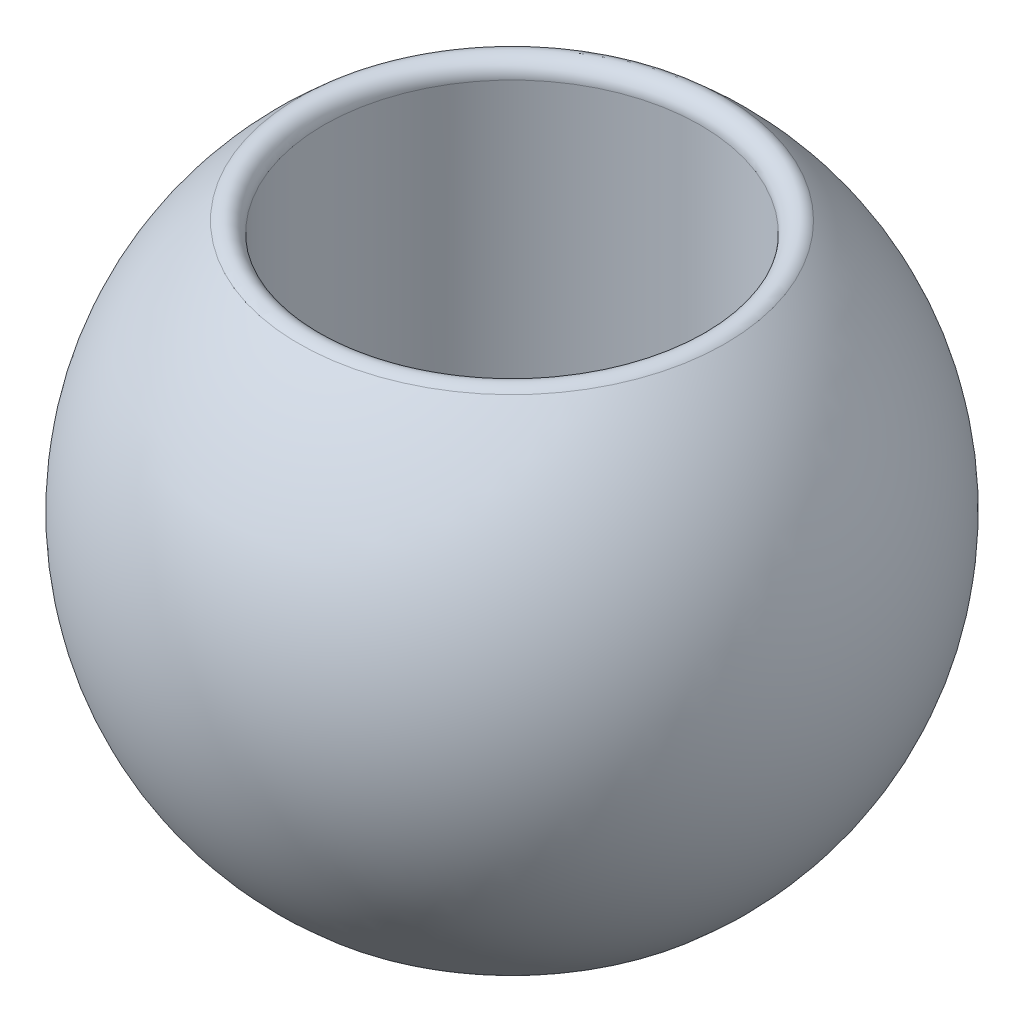
ISO-10303-21;
HEADER;
FILE_DESCRIPTION(('STEP AP214'),'2;1');
FILE_NAME('part.step','',(''),(''),'','','');
FILE_SCHEMA(('AUTOMOTIVE_DESIGN { 1 0 10303 214 1 1 1 1 }'));
ENDSEC;
DATA;
#1=APPLICATION_CONTEXT('core data for automotive mechanical design processes');
#2=APPLICATION_PROTOCOL_DEFINITION('international standard','automotive_design',2000,#1);
#3=PRODUCT_CONTEXT('',#1,'mechanical');
#4=PRODUCT('Part','Part','',(#3));
#5=PRODUCT_RELATED_PRODUCT_CATEGORY('part','',(#4));
#6=PRODUCT_DEFINITION_FORMATION('','',#4);
#7=PRODUCT_DEFINITION_CONTEXT('part definition',#1,'design');
#8=PRODUCT_DEFINITION('design','',#6,#7);
#9=PRODUCT_DEFINITION_SHAPE('','',#8);
#10=(LENGTH_UNIT() NAMED_UNIT(*) SI_UNIT(.MILLI.,.METRE.));
#11=(NAMED_UNIT(*) PLANE_ANGLE_UNIT() SI_UNIT($,.RADIAN.));
#12=(NAMED_UNIT(*) SI_UNIT($,.STERADIAN.) SOLID_ANGLE_UNIT());
#13=UNCERTAINTY_MEASURE_WITH_UNIT(LENGTH_MEASURE(1.E-05),#10,'distance_accuracy_value','');
#14=(GEOMETRIC_REPRESENTATION_CONTEXT(3) GLOBAL_UNCERTAINTY_ASSIGNED_CONTEXT((#13)) GLOBAL_UNIT_ASSIGNED_CONTEXT((#10,
#11,#12)) REPRESENTATION_CONTEXT('',''));
#15=CARTESIAN_POINT('',(0.,0.,0.));
#16=DIRECTION('',(0.,0.,1.));
#17=DIRECTION('',(1.,0.,0.));
#18=AXIS2_PLACEMENT_3D('',#15,#16,#17);
#19=CARTESIAN_POINT('',(0.,0.,0.));
#20=DIRECTION('',(0.,1.,0.));
#21=DIRECTION('',(1.,0.,0.));
#22=AXIS2_PLACEMENT_3D('',#19,#20,#21);
#23=SPHERICAL_SURFACE('',#22,11.1125);
#24=CARTESIAN_POINT('',(0.,-8.47593574202086,0.));
#25=DIRECTION('',(0.,1.,0.));
#26=DIRECTION('',(0.,0.,1.));
#27=AXIS2_PLACEMENT_3D('',#24,#25,#26);
#28=CIRCLE('',#27,7.18652694610778);
#29=CARTESIAN_POINT('',(7.18652694610778,-8.47593574202086,0.));
#30=VERTEX_POINT('',#29);
#31=EDGE_CURVE('E10',#30,#30,#28,.T.);
#32=CARTESIAN_POINT('',(0.,8.47593574202086,0.));
#33=DIRECTION('',(0.,-1.,0.));
#34=DIRECTION('',(0.,0.,-1.));
#35=AXIS2_PLACEMENT_3D('',#32,#33,#34);
#36=CIRCLE('',#35,7.18652694610778);
#37=CARTESIAN_POINT('',(7.18652694610778,8.47593574202086,0.));
#38=VERTEX_POINT('',#37);
#39=EDGE_CURVE('E41',#38,#38,#36,.T.);
#40=CARTESIAN_POINT('',(7.18652694610778,-8.47593574202086,0.));
#41=CARTESIAN_POINT('',(7.3397224286379,-8.34605277591836,0.));
#42=CARTESIAN_POINT('',(7.48938889445843,-8.21200845028996,0.));
#43=CARTESIAN_POINT('',(7.78124123238514,-7.93600940111017,0.));
#44=CARTESIAN_POINT('',(7.92342710449132,-7.79405467755877,0.));
#45=CARTESIAN_POINT('',(8.19989569469417,-7.50264715366175,0.));
#46=CARTESIAN_POINT('',(8.33417841279084,-7.35319435331613,0.));
#47=CARTESIAN_POINT('',(8.59444725510012,-7.0472312652697,0.));
#48=CARTESIAN_POINT('',(8.72043337931274,-6.8907209775689,0.));
#49=CARTESIAN_POINT('',(8.96373840079945,-6.57110257837938,0.));
#50=CARTESIAN_POINT('',(9.08105729807355,-6.40799446689067,0.));
#51=CARTESIAN_POINT('',(9.30668313039769,-6.07565992335759,0.));
#52=CARTESIAN_POINT('',(9.41499006544773,-5.90643349131322,0.));
#53=CARTESIAN_POINT('',(9.62227361273388,-5.56235967306929,0.));
#54=CARTESIAN_POINT('',(9.72125022497,-5.38751228686973,0.));
#55=CARTESIAN_POINT('',(9.90958222016924,-5.03271047998456,0.));
#56=CARTESIAN_POINT('',(9.99893760313236,-4.85275605929894,0.));
#57=CARTESIAN_POINT('',(10.1677645039858,-4.4882691051439,0.));
#58=CARTESIAN_POINT('',(10.2472360218762,-4.30373657167447,0.));
#59=CARTESIAN_POINT('',(10.3960616097027,-3.93063577198665,0.));
#60=CARTESIAN_POINT('',(10.4654156796388,-3.74206750576826,0.));
#61=CARTESIAN_POINT('',(10.5938025253777,-3.3614494818586,0.));
#62=CARTESIAN_POINT('',(10.6528353011805,-3.16939972416734,0.));
#63=CARTESIAN_POINT('',(10.7604060490633,-2.78238319158209,0.));
#64=CARTESIAN_POINT('',(10.8089440211434,-2.58741641668811,0.));
#65=CARTESIAN_POINT('',(10.8953824983631,-2.19513889764429,0.));
#66=CARTESIAN_POINT('',(10.9332830035027,-1.99782815349445,0.));
#67=CARTESIAN_POINT('',(10.9983351493661,-1.60144263331148,0.));
#68=CARTESIAN_POINT('',(11.0254867900898,-1.40236785727835,0.));
#69=CARTESIAN_POINT('',(11.0689614027938,-1.00303939555527,0.));
#70=CARTESIAN_POINT('',(11.085284374774,-0.802785709865313,0.));
#71=CARTESIAN_POINT('',(11.1070536733771,-0.401688016116905,0.));
#72=CARTESIAN_POINT('',(11.1125,-0.200844008058453,0.));
#73=CARTESIAN_POINT('',(11.1125,0.200844008058453,0.));
#74=CARTESIAN_POINT('',(11.1070536733771,0.401688016116905,0.));
#75=CARTESIAN_POINT('',(11.085284374774,0.802785709865313,0.));
#76=CARTESIAN_POINT('',(11.0689614027938,1.00303939555527,0.));
#77=CARTESIAN_POINT('',(11.0254867900898,1.40236785727835,0.));
#78=CARTESIAN_POINT('',(10.9983351493661,1.60144263331148,0.));
#79=CARTESIAN_POINT('',(10.9332830035027,1.99782815349445,0.));
#80=CARTESIAN_POINT('',(10.8953824983631,2.19513889764429,0.));
#81=CARTESIAN_POINT('',(10.8089440211434,2.58741641668811,0.));
#82=CARTESIAN_POINT('',(10.7604060490633,2.78238319158209,0.));
#83=CARTESIAN_POINT('',(10.6528353011805,3.16939972416734,0.));
#84=CARTESIAN_POINT('',(10.5938025253777,3.3614494818586,0.));
#85=CARTESIAN_POINT('',(10.4654156796388,3.74206750576826,0.));
#86=CARTESIAN_POINT('',(10.3960616097027,3.93063577198665,0.));
#87=CARTESIAN_POINT('',(10.2472360218762,4.30373657167447,0.));
#88=CARTESIAN_POINT('',(10.1677645039858,4.4882691051439,0.));
#89=CARTESIAN_POINT('',(9.99893760313236,4.85275605929894,0.));
#90=CARTESIAN_POINT('',(9.90958222016924,5.03271047998456,0.));
#91=CARTESIAN_POINT('',(9.72125022497,5.38751228686973,0.));
#92=CARTESIAN_POINT('',(9.62227361273389,5.56235967306929,0.));
#93=CARTESIAN_POINT('',(9.41499006544773,5.90643349131322,0.));
#94=CARTESIAN_POINT('',(9.30668313039769,6.07565992335759,0.));
#95=CARTESIAN_POINT('',(9.08105729807355,6.40799446689067,0.));
#96=CARTESIAN_POINT('',(8.96373840079945,6.57110257837938,0.));
#97=CARTESIAN_POINT('',(8.72043337931274,6.8907209775689,0.));
#98=CARTESIAN_POINT('',(8.59444725510012,7.0472312652697,0.));
#99=CARTESIAN_POINT('',(8.33417841279084,7.35319435331613,0.));
#100=CARTESIAN_POINT('',(8.19989569469417,7.50264715366175,0.));
#101=CARTESIAN_POINT('',(7.92342710449132,7.79405467755877,0.));
#102=CARTESIAN_POINT('',(7.78124123238514,7.93600940111017,0.));
#103=CARTESIAN_POINT('',(7.48938889445843,8.21200845028996,0.));
#104=CARTESIAN_POINT('',(7.3397224286379,8.34605277591836,0.));
#105=CARTESIAN_POINT('',(7.18652694610778,8.47593574202086,0.));
#106=B_SPLINE_CURVE_WITH_KNOTS('',3,(#40,#41,#42,#43,#44,#45,#46,#47,#48,#49,#50,#51,#52,#53,
#54,#55,#56,#57,#58,#59,#60,#61,#62,#63,#64,#65,#66,#67,#68,#69,#70,#71,#72,#73,#74,#75,#76,#77,
#78,#79,#80,#81,#82,#83,#84,#85,#86,#87,#88,#89,#90,#91,#92,#93,#94,#95,#96,#97,#98,#99,#100,
#101,#102,#103,#104,#105),.UNSPECIFIED.,.F.,.F.,(4,2,2,2,2,2,2,2,2,2,2,2,2,2,2,2,2,2,2,2,2,2,2,
2,2,2,2,2,2,2,2,2,4),(0.,0.602458247449576,1.20491649489915,1.80737474234873,2.40983298979831,
3.01229123724788,3.61474948469746,4.21720773214704,4.81966597959661,5.42212422704619,
6.02458247449577,6.62704072194534,7.22949896939492,7.8319572168445,8.43441546429407,
9.03687371174365,9.63933195919323,10.2417902066428,10.8442484540924,11.446706701542,
12.0491649489915,12.6516231964411,13.2540814438907,13.8565396913403,14.4589979387898,
15.0614561862394,15.663914433689,16.2663726811386,16.8688309285881,17.4712891760377,
18.0737474234873,18.6762056709369,19.2786639183864),.UNSPECIFIED.);
#107=EDGE_CURVE('BSEAM34',#30,#38,#106,.T.);
#108=ORIENTED_EDGE('',*,*,#31,.T.);
#109=ORIENTED_EDGE('',*,*,#39,.T.);
#110=ORIENTED_EDGE('',*,*,#107,.T.);
#111=ORIENTED_EDGE('',*,*,#107,.F.);
#112=EDGE_LOOP('',(#108,#110,#109,#111));
#113=FACE_BOUND('',#112,.T.);
#114=ADVANCED_FACE('F34',(#113),#23,.T.);
#115=CARTESIAN_POINT('',(0.,-25.4,0.));
#116=DIRECTION('',(0.,1.,0.));
#117=DIRECTION('',(0.,0.,1.));
#118=AXIS2_PLACEMENT_3D('',#115,#116,#117);
#119=CYLINDRICAL_SURFACE('',#118,6.35);
#120=CARTESIAN_POINT('',(0.,-8.08846439381419,0.));
#121=DIRECTION('',(0.,1.,0.));
#122=DIRECTION('',(0.,0.,1.));
#123=AXIS2_PLACEMENT_3D('',#120,#121,#122);
#124=CIRCLE('',#123,6.35);
#125=CARTESIAN_POINT('',(0.,-8.08846439381419,6.35));
#126=VERTEX_POINT('',#125);
#127=EDGE_CURVE('E45',#126,#126,#124,.F.);
#128=ORIENTED_EDGE('',*,*,#127,.T.);
#129=EDGE_LOOP('',(#128));
#130=FACE_BOUND('',#129,.T.);
#131=CARTESIAN_POINT('',(0.,8.08846439381419,0.));
#132=DIRECTION('',(0.,-1.,0.));
#133=DIRECTION('',(0.,0.,-1.));
#134=AXIS2_PLACEMENT_3D('',#131,#132,#133);
#135=CIRCLE('',#134,6.35);
#136=CARTESIAN_POINT('',(0.,8.08846439381419,-6.35));
#137=VERTEX_POINT('',#136);
#138=EDGE_CURVE('E49',#137,#137,#135,.F.);
#139=ORIENTED_EDGE('',*,*,#138,.T.);
#140=EDGE_LOOP('',(#139));
#141=FACE_BOUND('',#140,.T.);
#142=ADVANCED_FACE('F55',(#130,#141),#119,.F.);
#143=CARTESIAN_POINT('',(0.,-8.08846439381419,0.));
#144=DIRECTION('',(0.,1.,0.));
#145=DIRECTION('',(0.,0.,1.));
#146=AXIS2_PLACEMENT_3D('',#143,#144,#145);
#147=TOROIDAL_SURFACE('',#146,6.858,0.508);
#148=ORIENTED_EDGE('',*,*,#31,.F.);
#149=EDGE_LOOP('',(#148));
#150=FACE_BOUND('',#149,.T.);
#151=ORIENTED_EDGE('',*,*,#127,.F.);
#152=EDGE_LOOP('',(#151));
#153=FACE_BOUND('',#152,.T.);
#154=ADVANCED_FACE('F58',(#150,#153),#147,.T.);
#155=CARTESIAN_POINT('',(0.,8.08846439381419,0.));
#156=DIRECTION('',(0.,-1.,0.));
#157=DIRECTION('',(0.,0.,-1.));
#158=AXIS2_PLACEMENT_3D('',#155,#156,#157);
#159=TOROIDAL_SURFACE('',#158,6.858,0.508);
#160=ORIENTED_EDGE('',*,*,#39,.F.);
#161=EDGE_LOOP('',(#160));
#162=FACE_BOUND('',#161,.T.);
#163=ORIENTED_EDGE('',*,*,#138,.F.);
#164=EDGE_LOOP('',(#163));
#165=FACE_BOUND('',#164,.T.);
#166=ADVANCED_FACE('F36',(#162,#165),#159,.T.);
#167=CLOSED_SHELL('',(#114,#142,#154,#166));
#168=MANIFOLD_SOLID_BREP('B2',#167);
#169=ADVANCED_BREP_SHAPE_REPRESENTATION('',(#18,#168),#14);
#170=SHAPE_DEFINITION_REPRESENTATION(#9,#169);
ENDSEC;
END-ISO-10303-21;
